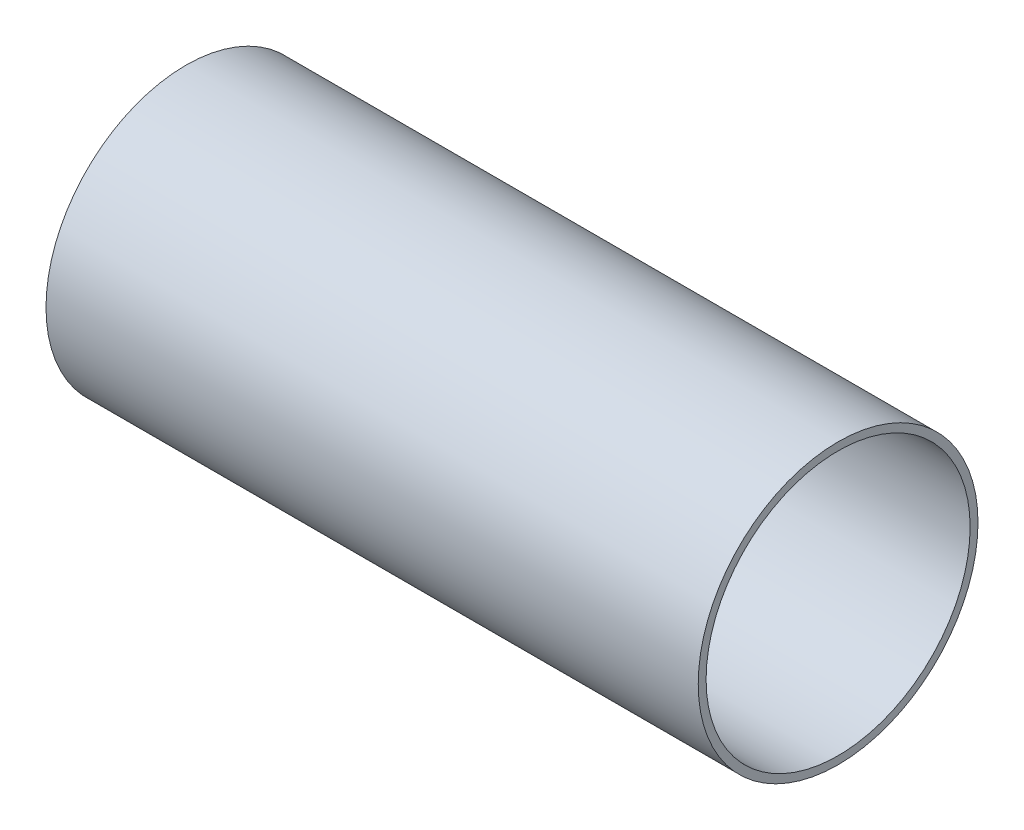
ISO-10303-21;
HEADER;
FILE_DESCRIPTION(('STEP AP214'),'2;1');
FILE_NAME('part.step','',(''),(''),'','','');
FILE_SCHEMA(('AUTOMOTIVE_DESIGN { 1 0 10303 214 1 1 1 1 }'));
ENDSEC;
DATA;
#1=APPLICATION_CONTEXT('core data for automotive mechanical design processes');
#2=APPLICATION_PROTOCOL_DEFINITION('international standard','automotive_design',2000,#1);
#3=PRODUCT_CONTEXT('',#1,'mechanical');
#4=PRODUCT('Part','Part','',(#3));
#5=PRODUCT_RELATED_PRODUCT_CATEGORY('part','',(#4));
#6=PRODUCT_DEFINITION_FORMATION('','',#4);
#7=PRODUCT_DEFINITION_CONTEXT('part definition',#1,'design');
#8=PRODUCT_DEFINITION('design','',#6,#7);
#9=PRODUCT_DEFINITION_SHAPE('','',#8);
#10=(LENGTH_UNIT() NAMED_UNIT(*) SI_UNIT(.MILLI.,.METRE.));
#11=(NAMED_UNIT(*) PLANE_ANGLE_UNIT() SI_UNIT($,.RADIAN.));
#12=(NAMED_UNIT(*) SI_UNIT($,.STERADIAN.) SOLID_ANGLE_UNIT());
#13=UNCERTAINTY_MEASURE_WITH_UNIT(LENGTH_MEASURE(1.E-05),#10,'distance_accuracy_value','');
#14=(GEOMETRIC_REPRESENTATION_CONTEXT(3) GLOBAL_UNCERTAINTY_ASSIGNED_CONTEXT((#13)) GLOBAL_UNIT_ASSIGNED_CONTEXT((#10,
#11,#12)) REPRESENTATION_CONTEXT('',''));
#15=CARTESIAN_POINT('',(0.,0.,0.));
#16=DIRECTION('',(0.,0.,1.));
#17=DIRECTION('',(1.,0.,0.));
#18=AXIS2_PLACEMENT_3D('',#15,#16,#17);
#19=CARTESIAN_POINT('',(43.2733333333,0.,0.));
#20=DIRECTION('',(-1.,0.,0.));
#21=DIRECTION('',(0.,0.,1.));
#22=AXIS2_PLACEMENT_3D('',#19,#20,#21);
#23=PLANE('',#22);
#24=CARTESIAN_POINT('',(43.2733333333,0.,0.));
#25=DIRECTION('',(-1.,0.,0.));
#26=DIRECTION('',(0.,0.,1.));
#27=AXIS2_PLACEMENT_3D('',#24,#25,#26);
#28=CIRCLE('',#27,7.55);
#29=CARTESIAN_POINT('',(43.2733333333,0.,7.55));
#30=VERTEX_POINT('',#29);
#31=EDGE_CURVE('E34',#30,#30,#28,.F.);
#32=ORIENTED_EDGE('',*,*,#31,.T.);
#33=EDGE_LOOP('',(#32));
#34=FACE_BOUND('',#33,.T.);
#35=CARTESIAN_POINT('',(43.2733333333,0.,0.));
#36=DIRECTION('',(1.,0.,0.));
#37=DIRECTION('',(0.,0.,-1.));
#38=AXIS2_PLACEMENT_3D('',#35,#36,#37);
#39=CIRCLE('',#38,3.);
#40=CARTESIAN_POINT('',(43.2733333333,0.,-3.));
#41=VERTEX_POINT('',#40);
#42=EDGE_CURVE('E18',#41,#41,#39,.F.);
#43=ORIENTED_EDGE('',*,*,#42,.T.);
#44=EDGE_LOOP('',(#43));
#45=FACE_BOUND('',#44,.T.);
#46=ADVANCED_FACE('F15',(#34,#45),#23,.F.);
#47=CARTESIAN_POINT('',(50.49,0.,0.));
#48=DIRECTION('',(1.,0.,0.));
#49=DIRECTION('',(0.,0.,-1.));
#50=AXIS2_PLACEMENT_3D('',#47,#48,#49);
#51=CYLINDRICAL_SURFACE('',#50,3.);
#52=CARTESIAN_POINT('',(31.84,0.,0.));
#53=DIRECTION('',(1.,0.,0.));
#54=DIRECTION('',(0.,0.,-1.));
#55=AXIS2_PLACEMENT_3D('',#52,#53,#54);
#56=CIRCLE('',#55,3.);
#57=CARTESIAN_POINT('',(31.84,0.,-3.));
#58=VERTEX_POINT('',#57);
#59=EDGE_CURVE('E32',#58,#58,#56,.T.);
#60=ORIENTED_EDGE('',*,*,#59,.F.);
#61=EDGE_LOOP('',(#60));
#62=FACE_BOUND('',#61,.T.);
#63=ORIENTED_EDGE('',*,*,#42,.F.);
#64=EDGE_LOOP('',(#63));
#65=FACE_BOUND('',#64,.T.);
#66=ADVANCED_FACE('F42',(#62,#65),#51,.F.);
#67=CARTESIAN_POINT('',(56.20666666665,0.,0.));
#68=DIRECTION('',(-1.,0.,0.));
#69=DIRECTION('',(0.,0.,1.));
#70=AXIS2_PLACEMENT_3D('',#67,#68,#69);
#71=CYLINDRICAL_SURFACE('',#70,7.55);
#72=CARTESIAN_POINT('',(69.14,0.,0.));
#73=DIRECTION('',(-1.,0.,0.));
#74=DIRECTION('',(0.,0.,1.));
#75=AXIS2_PLACEMENT_3D('',#72,#73,#74);
#76=CIRCLE('',#75,7.55);
#77=CARTESIAN_POINT('',(69.14,0.,7.55));
#78=VERTEX_POINT('',#77);
#79=EDGE_CURVE('E27',#78,#78,#76,.T.);
#80=ORIENTED_EDGE('',*,*,#79,.F.);
#81=EDGE_LOOP('',(#80));
#82=FACE_BOUND('',#81,.T.);
#83=ORIENTED_EDGE('',*,*,#31,.F.);
#84=EDGE_LOOP('',(#83));
#85=FACE_BOUND('',#84,.T.);
#86=ADVANCED_FACE('F44',(#82,#85),#71,.F.);
#87=CARTESIAN_POINT('',(31.84,0.,5.5));
#88=DIRECTION('',(-1.,0.,0.));
#89=DIRECTION('',(0.,0.,1.));
#90=AXIS2_PLACEMENT_3D('',#87,#88,#89);
#91=PLANE('',#90);
#92=ORIENTED_EDGE('',*,*,#59,.T.);
#93=EDGE_LOOP('',(#92));
#94=FACE_BOUND('',#93,.T.);
#95=CARTESIAN_POINT('',(31.84,0.,0.));
#96=DIRECTION('',(1.,0.,0.));
#97=DIRECTION('',(0.,0.,-1.));
#98=AXIS2_PLACEMENT_3D('',#95,#96,#97);
#99=CIRCLE('',#98,8.);
#100=CARTESIAN_POINT('',(31.84,0.,-8.));
#101=VERTEX_POINT('',#100);
#102=EDGE_CURVE('E22',#101,#101,#99,.T.);
#103=ORIENTED_EDGE('',*,*,#102,.F.);
#104=EDGE_LOOP('',(#103));
#105=FACE_BOUND('',#104,.T.);
#106=ADVANCED_FACE('F51',(#94,#105),#91,.T.);
#107=CARTESIAN_POINT('',(69.14,0.,5.5));
#108=DIRECTION('',(1.,0.,0.));
#109=DIRECTION('',(0.,0.,-1.));
#110=AXIS2_PLACEMENT_3D('',#107,#108,#109);
#111=PLANE('',#110);
#112=CARTESIAN_POINT('',(69.14,0.,0.));
#113=DIRECTION('',(1.,0.,0.));
#114=DIRECTION('',(0.,0.,-1.));
#115=AXIS2_PLACEMENT_3D('',#112,#113,#114);
#116=CIRCLE('',#115,8.);
#117=CARTESIAN_POINT('',(69.14,0.,-8.));
#118=VERTEX_POINT('',#117);
#119=EDGE_CURVE('E10',#118,#118,#116,.F.);
#120=ORIENTED_EDGE('',*,*,#119,.F.);
#121=EDGE_LOOP('',(#120));
#122=FACE_BOUND('',#121,.T.);
#123=ORIENTED_EDGE('',*,*,#79,.T.);
#124=EDGE_LOOP('',(#123));
#125=FACE_BOUND('',#124,.T.);
#126=ADVANCED_FACE('F57',(#122,#125),#111,.T.);
#127=CARTESIAN_POINT('',(50.49,0.,0.));
#128=DIRECTION('',(1.,0.,0.));
#129=DIRECTION('',(0.,0.,-1.));
#130=AXIS2_PLACEMENT_3D('',#127,#128,#129);
#131=CYLINDRICAL_SURFACE('',#130,8.);
#132=ORIENTED_EDGE('',*,*,#102,.T.);
#133=EDGE_LOOP('',(#132));
#134=FACE_BOUND('',#133,.T.);
#135=ORIENTED_EDGE('',*,*,#119,.T.);
#136=EDGE_LOOP('',(#135));
#137=FACE_BOUND('',#136,.T.);
#138=ADVANCED_FACE('F55',(#134,#137),#131,.T.);
#139=CLOSED_SHELL('',(#46,#66,#86,#106,#126,#138));
#140=MANIFOLD_SOLID_BREP('B1',#139);
#141=ADVANCED_BREP_SHAPE_REPRESENTATION('',(#18,#140),#14);
#142=SHAPE_DEFINITION_REPRESENTATION(#9,#141);
ENDSEC;
END-ISO-10303-21;
